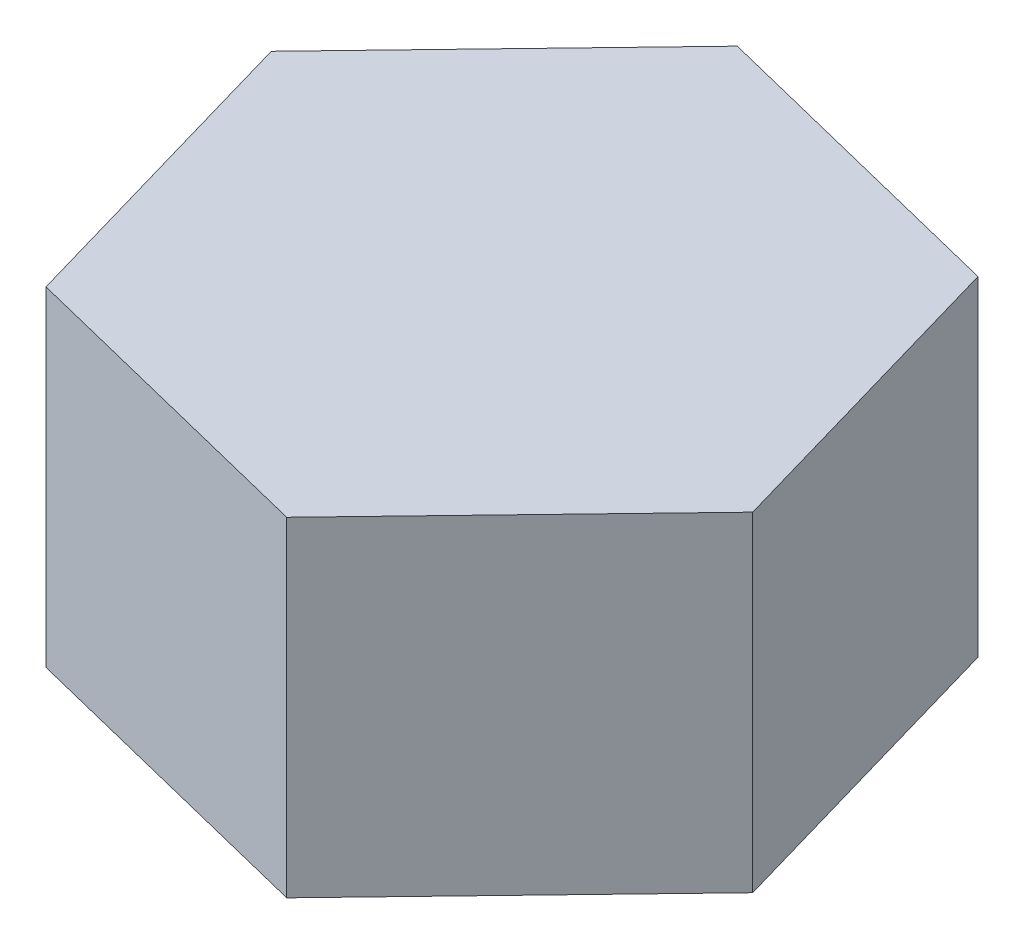
ISO-10303-21;
HEADER;
FILE_DESCRIPTION(('STEP AP214'),'2;1');
FILE_NAME('part.step','',(''),(''),'','','');
FILE_SCHEMA(('AUTOMOTIVE_DESIGN { 1 0 10303 214 1 1 1 1 }'));
ENDSEC;
DATA;
#1=APPLICATION_CONTEXT('core data for automotive mechanical design processes');
#2=APPLICATION_PROTOCOL_DEFINITION('international standard','automotive_design',2000,#1);
#3=PRODUCT_CONTEXT('',#1,'mechanical');
#4=PRODUCT('Part','Part','',(#3));
#5=PRODUCT_RELATED_PRODUCT_CATEGORY('part','',(#4));
#6=PRODUCT_DEFINITION_FORMATION('','',#4);
#7=PRODUCT_DEFINITION_CONTEXT('part definition',#1,'design');
#8=PRODUCT_DEFINITION('design','',#6,#7);
#9=PRODUCT_DEFINITION_SHAPE('','',#8);
#10=(LENGTH_UNIT() NAMED_UNIT(*) SI_UNIT(.MILLI.,.METRE.));
#11=(NAMED_UNIT(*) PLANE_ANGLE_UNIT() SI_UNIT($,.RADIAN.));
#12=(NAMED_UNIT(*) SI_UNIT($,.STERADIAN.) SOLID_ANGLE_UNIT());
#13=UNCERTAINTY_MEASURE_WITH_UNIT(LENGTH_MEASURE(1.E-05),#10,'distance_accuracy_value','');
#14=(GEOMETRIC_REPRESENTATION_CONTEXT(3) GLOBAL_UNCERTAINTY_ASSIGNED_CONTEXT((#13)) GLOBAL_UNIT_ASSIGNED_CONTEXT((#10,
#11,#12)) REPRESENTATION_CONTEXT('',''));
#15=CARTESIAN_POINT('',(0.,0.,0.));
#16=DIRECTION('',(0.,0.,1.));
#17=DIRECTION('',(1.,0.,0.));
#18=AXIS2_PLACEMENT_3D('',#15,#16,#17);
#19=CARTESIAN_POINT('',(19.4141188048618,20.,4.80541268058345));
#20=DIRECTION('',(-0.960791320869561,0.,0.277272497268887));
#21=DIRECTION('',(0.277272497268887,0.,0.960791320869561));
#22=AXIS2_PLACEMENT_3D('',#19,#20,#21);
#23=PLANE('',#22);
#24=DIRECTION('',(-0.277272497268887,0.,-0.96079132086956));
#25=VECTOR('',#24,1.);
#26=CARTESIAN_POINT('',(19.4141188048618,0.,4.80541268058345));
#27=LINE('',#26,#25);
#28=CARTESIAN_POINT('',(19.4141188048618,0.,4.80541268058345));
#29=VERTEX_POINT('',#28);
#30=CARTESIAN_POINT('',(13.868668859484,0.,-14.4104137368078));
#31=VERTEX_POINT('',#30);
#32=EDGE_CURVE('E119',#29,#31,#27,.T.);
#33=ORIENTED_EDGE('',*,*,#32,.T.);
#34=DIRECTION('',(0.,-1.,0.));
#35=VECTOR('',#34,1.);
#36=CARTESIAN_POINT('',(13.868668859484,20.,-14.4104137368078));
#37=LINE('',#36,#35);
#38=CARTESIAN_POINT('',(13.868668859484,20.,-14.4104137368078));
#39=VERTEX_POINT('',#38);
#40=EDGE_CURVE('E11',#39,#31,#37,.T.);
#41=ORIENTED_EDGE('',*,*,#40,.F.);
#42=DIRECTION('',(-0.277272497268887,0.,-0.96079132086956));
#43=VECTOR('',#42,1.);
#44=CARTESIAN_POINT('',(19.4141188048618,20.,4.80541268058345));
#45=LINE('',#44,#43);
#46=CARTESIAN_POINT('',(19.4141188048618,20.,4.80541268058345));
#47=VERTEX_POINT('',#46);
#48=EDGE_CURVE('E129',#47,#39,#45,.T.);
#49=ORIENTED_EDGE('',*,*,#48,.F.);
#50=DIRECTION('',(0.,-1.,0.));
#51=VECTOR('',#50,1.);
#52=CARTESIAN_POINT('',(19.4141188048618,20.,4.80541268058345));
#53=LINE('',#52,#51);
#54=EDGE_CURVE('E115',#47,#29,#53,.T.);
#55=ORIENTED_EDGE('',*,*,#54,.T.);
#56=EDGE_LOOP('',(#33,#41,#49,#55));
#57=FACE_BOUND('',#56,.T.);
#58=ADVANCED_FACE('F35',(#57),#23,.F.);
#59=CARTESIAN_POINT('',(13.868668859484,20.,-14.4104137368078));
#60=DIRECTION('',(-0.240270634029173,0.,0.970705940243089));
#61=DIRECTION('',(0.970705940243089,0.,0.240270634029173));
#62=AXIS2_PLACEMENT_3D('',#59,#60,#61);
#63=PLANE('',#62);
#64=DIRECTION('',(-0.970705940243089,0.,-0.240270634029173));
#65=VECTOR('',#64,1.);
#66=CARTESIAN_POINT('',(13.868668859484,0.,-14.4104137368078));
#67=LINE('',#66,#65);
#68=CARTESIAN_POINT('',(-5.54544994537774,0.,-19.2158264173912));
#69=VERTEX_POINT('',#68);
#70=EDGE_CURVE('E122',#31,#69,#67,.T.);
#71=ORIENTED_EDGE('',*,*,#70,.T.);
#72=DIRECTION('',(0.,-1.,0.));
#73=VECTOR('',#72,1.);
#74=CARTESIAN_POINT('',(-5.54544994537774,20.,-19.2158264173912));
#75=LINE('',#74,#73);
#76=CARTESIAN_POINT('',(-5.54544994537774,20.,-19.2158264173912));
#77=VERTEX_POINT('',#76);
#78=EDGE_CURVE('E43',#77,#69,#75,.T.);
#79=ORIENTED_EDGE('',*,*,#78,.F.);
#80=DIRECTION('',(-0.970705940243089,0.,-0.240270634029173));
#81=VECTOR('',#80,1.);
#82=CARTESIAN_POINT('',(13.868668859484,20.,-14.4104137368078));
#83=LINE('',#82,#81);
#84=EDGE_CURVE('E88',#39,#77,#83,.T.);
#85=ORIENTED_EDGE('',*,*,#84,.F.);
#86=ORIENTED_EDGE('',*,*,#40,.T.);
#87=EDGE_LOOP('',(#71,#79,#85,#86));
#88=FACE_BOUND('',#87,.T.);
#89=ADVANCED_FACE('F153',(#88),#63,.F.);
#90=CARTESIAN_POINT('',(-5.54544994537774,20.,-19.2158264173912));
#91=DIRECTION('',(0.720520686840388,0.,0.693433442974202));
#92=DIRECTION('',(0.693433442974202,0.,-0.720520686840388));
#93=AXIS2_PLACEMENT_3D('',#90,#91,#92);
#94=PLANE('',#93);
#95=DIRECTION('',(-0.693433442974202,0.,0.720520686840388));
#96=VECTOR('',#95,1.);
#97=CARTESIAN_POINT('',(-5.54544994537774,0.,-19.2158264173912));
#98=LINE('',#97,#96);
#99=CARTESIAN_POINT('',(-19.4141188048618,0.,-4.80541268058345));
#100=VERTEX_POINT('',#99);
#101=EDGE_CURVE('E124',#69,#100,#98,.T.);
#102=ORIENTED_EDGE('',*,*,#101,.T.);
#103=DIRECTION('',(0.,-1.,0.));
#104=VECTOR('',#103,1.);
#105=CARTESIAN_POINT('',(-19.4141188048618,20.,-4.80541268058345));
#106=LINE('',#105,#104);
#107=CARTESIAN_POINT('',(-19.4141188048618,20.,-4.80541268058345));
#108=VERTEX_POINT('',#107);
#109=EDGE_CURVE('E110',#108,#100,#106,.T.);
#110=ORIENTED_EDGE('',*,*,#109,.F.);
#111=DIRECTION('',(-0.693433442974202,0.,0.720520686840388));
#112=VECTOR('',#111,1.);
#113=CARTESIAN_POINT('',(-5.54544994537774,20.,-19.2158264173912));
#114=LINE('',#113,#112);
#115=EDGE_CURVE('E101',#77,#108,#114,.T.);
#116=ORIENTED_EDGE('',*,*,#115,.F.);
#117=ORIENTED_EDGE('',*,*,#78,.T.);
#118=EDGE_LOOP('',(#102,#110,#116,#117));
#119=FACE_BOUND('',#118,.T.);
#120=ADVANCED_FACE('F135',(#119),#94,.F.);
#121=CARTESIAN_POINT('',(-19.4141188048618,20.,-4.80541268058345));
#122=DIRECTION('',(0.960791320869561,0.,-0.277272497268887));
#123=DIRECTION('',(-0.277272497268887,0.,-0.960791320869561));
#124=AXIS2_PLACEMENT_3D('',#121,#122,#123);
#125=PLANE('',#124);
#126=DIRECTION('',(0.277272497268887,0.,0.960791320869561));
#127=VECTOR('',#126,1.);
#128=CARTESIAN_POINT('',(-19.4141188048618,0.,-4.80541268058345));
#129=LINE('',#128,#127);
#130=CARTESIAN_POINT('',(-13.868668859484,0.,14.4104137368078));
#131=VERTEX_POINT('',#130);
#132=EDGE_CURVE('E109',#100,#131,#129,.T.);
#133=ORIENTED_EDGE('',*,*,#132,.T.);
#134=DIRECTION('',(0.,-1.,0.));
#135=VECTOR('',#134,1.);
#136=CARTESIAN_POINT('',(-13.868668859484,20.,14.4104137368078));
#137=LINE('',#136,#135);
#138=CARTESIAN_POINT('',(-13.868668859484,20.,14.4104137368078));
#139=VERTEX_POINT('',#138);
#140=EDGE_CURVE('E106',#139,#131,#137,.T.);
#141=ORIENTED_EDGE('',*,*,#140,.F.);
#142=DIRECTION('',(0.277272497268887,0.,0.960791320869561));
#143=VECTOR('',#142,1.);
#144=CARTESIAN_POINT('',(-19.4141188048618,20.,-4.80541268058345));
#145=LINE('',#144,#143);
#146=EDGE_CURVE('E95',#108,#139,#145,.T.);
#147=ORIENTED_EDGE('',*,*,#146,.F.);
#148=ORIENTED_EDGE('',*,*,#109,.T.);
#149=EDGE_LOOP('',(#133,#141,#147,#148));
#150=FACE_BOUND('',#149,.T.);
#151=ADVANCED_FACE('F107',(#150),#125,.F.);
#152=CARTESIAN_POINT('',(-13.868668859484,20.,14.4104137368078));
#153=DIRECTION('',(0.240270634029172,0.,-0.970705940243089));
#154=DIRECTION('',(-0.970705940243089,0.,-0.240270634029172));
#155=AXIS2_PLACEMENT_3D('',#152,#153,#154);
#156=PLANE('',#155);
#157=DIRECTION('',(0.970705940243089,0.,0.240270634029172));
#158=VECTOR('',#157,1.);
#159=CARTESIAN_POINT('',(-13.868668859484,0.,14.4104137368078));
#160=LINE('',#159,#158);
#161=CARTESIAN_POINT('',(5.54544994537775,0.,19.2158264173912));
#162=VERTEX_POINT('',#161);
#163=EDGE_CURVE('E74',#131,#162,#160,.T.);
#164=ORIENTED_EDGE('',*,*,#163,.T.);
#165=DIRECTION('',(0.,-1.,0.));
#166=VECTOR('',#165,1.);
#167=CARTESIAN_POINT('',(5.54544994537775,20.,19.2158264173912));
#168=LINE('',#167,#166);
#169=CARTESIAN_POINT('',(5.54544994537775,20.,19.2158264173912));
#170=VERTEX_POINT('',#169);
#171=EDGE_CURVE('E111',#170,#162,#168,.T.);
#172=ORIENTED_EDGE('',*,*,#171,.F.);
#173=DIRECTION('',(0.970705940243089,0.,0.240270634029172));
#174=VECTOR('',#173,1.);
#175=CARTESIAN_POINT('',(-13.868668859484,20.,14.4104137368078));
#176=LINE('',#175,#174);
#177=EDGE_CURVE('E99',#139,#170,#176,.T.);
#178=ORIENTED_EDGE('',*,*,#177,.F.);
#179=ORIENTED_EDGE('',*,*,#140,.T.);
#180=EDGE_LOOP('',(#164,#172,#178,#179));
#181=FACE_BOUND('',#180,.T.);
#182=ADVANCED_FACE('F113',(#181),#156,.F.);
#183=CARTESIAN_POINT('',(5.54544994537775,20.,19.2158264173912));
#184=DIRECTION('',(-0.720520686840388,0.,-0.693433442974202));
#185=DIRECTION('',(-0.693433442974202,0.,0.720520686840388));
#186=AXIS2_PLACEMENT_3D('',#183,#184,#185);
#187=PLANE('',#186);
#188=DIRECTION('',(0.693433442974202,0.,-0.720520686840388));
#189=VECTOR('',#188,1.);
#190=CARTESIAN_POINT('',(5.54544994537775,0.,19.2158264173912));
#191=LINE('',#190,#189);
#192=EDGE_CURVE('E80',#162,#29,#191,.T.);
#193=ORIENTED_EDGE('',*,*,#192,.T.);
#194=ORIENTED_EDGE('',*,*,#54,.F.);
#195=DIRECTION('',(0.693433442974202,0.,-0.720520686840388));
#196=VECTOR('',#195,1.);
#197=CARTESIAN_POINT('',(5.54544994537775,20.,19.2158264173912));
#198=LINE('',#197,#196);
#199=EDGE_CURVE('E51',#170,#47,#198,.T.);
#200=ORIENTED_EDGE('',*,*,#199,.F.);
#201=ORIENTED_EDGE('',*,*,#171,.T.);
#202=EDGE_LOOP('',(#193,#194,#200,#201));
#203=FACE_BOUND('',#202,.T.);
#204=ADVANCED_FACE('F142',(#203),#187,.F.);
#205=CARTESIAN_POINT('',(0.,20.,0.));
#206=DIRECTION('',(0.,1.,0.));
#207=DIRECTION('',(0.,0.,1.));
#208=AXIS2_PLACEMENT_3D('',#205,#206,#207);
#209=PLANE('',#208);
#210=ORIENTED_EDGE('',*,*,#48,.T.);
#211=ORIENTED_EDGE('',*,*,#84,.T.);
#212=ORIENTED_EDGE('',*,*,#115,.T.);
#213=ORIENTED_EDGE('',*,*,#146,.T.);
#214=ORIENTED_EDGE('',*,*,#177,.T.);
#215=ORIENTED_EDGE('',*,*,#199,.T.);
#216=EDGE_LOOP('',(#210,#211,#212,#213,#214,#215));
#217=FACE_BOUND('',#216,.T.);
#218=ADVANCED_FACE('F97',(#217),#209,.T.);
#219=CARTESIAN_POINT('',(0.,0.,0.));
#220=DIRECTION('',(0.,1.,0.));
#221=DIRECTION('',(0.,0.,1.));
#222=AXIS2_PLACEMENT_3D('',#219,#220,#221);
#223=PLANE('',#222);
#224=ORIENTED_EDGE('',*,*,#32,.F.);
#225=ORIENTED_EDGE('',*,*,#192,.F.);
#226=ORIENTED_EDGE('',*,*,#163,.F.);
#227=ORIENTED_EDGE('',*,*,#132,.F.);
#228=ORIENTED_EDGE('',*,*,#101,.F.);
#229=ORIENTED_EDGE('',*,*,#70,.F.);
#230=EDGE_LOOP('',(#224,#225,#226,#227,#228,#229));
#231=FACE_BOUND('',#230,.T.);
#232=ADVANCED_FACE('F138',(#231),#223,.F.);
#233=CLOSED_SHELL('',(#58,#89,#120,#151,#182,#204,#218,#232));
#234=MANIFOLD_SOLID_BREP('B2',#233);
#235=ADVANCED_BREP_SHAPE_REPRESENTATION('',(#18,#234),#14);
#236=SHAPE_DEFINITION_REPRESENTATION(#9,#235);
ENDSEC;
END-ISO-10303-21;
